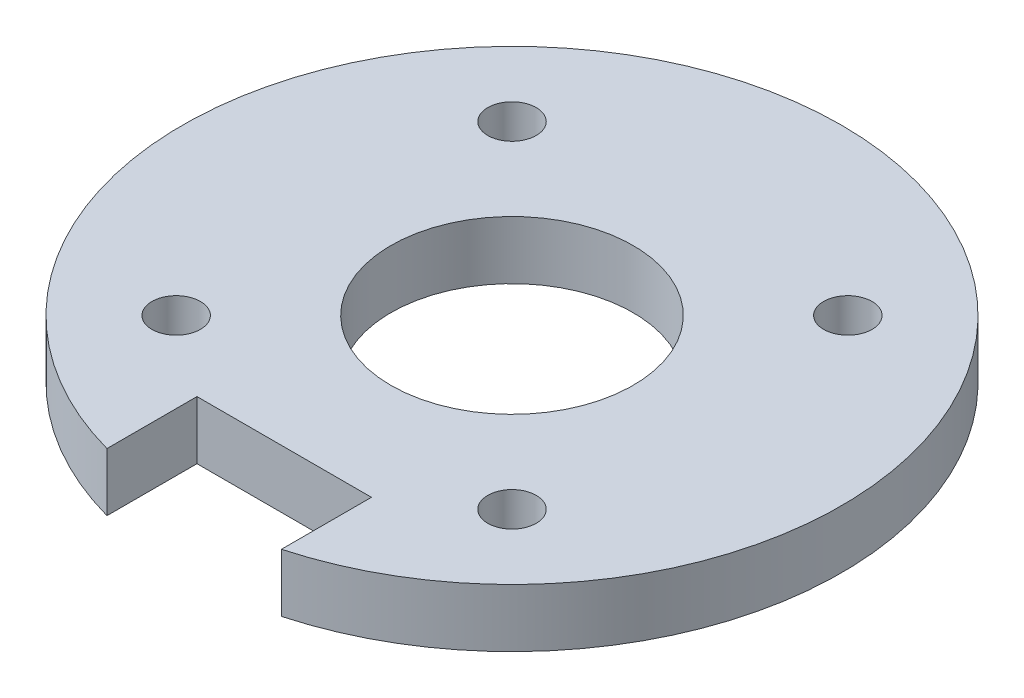
ISO-10303-21;
HEADER;
FILE_DESCRIPTION(('STEP AP214'),'2;1');
FILE_NAME('part.step','',(''),(''),'','','');
FILE_SCHEMA(('AUTOMOTIVE_DESIGN { 1 0 10303 214 1 1 1 1 }'));
ENDSEC;
DATA;
#1=APPLICATION_CONTEXT('core data for automotive mechanical design processes');
#2=APPLICATION_PROTOCOL_DEFINITION('international standard','automotive_design',2000,#1);
#3=PRODUCT_CONTEXT('',#1,'mechanical');
#4=PRODUCT('Part','Part','',(#3));
#5=PRODUCT_RELATED_PRODUCT_CATEGORY('part','',(#4));
#6=PRODUCT_DEFINITION_FORMATION('','',#4);
#7=PRODUCT_DEFINITION_CONTEXT('part definition',#1,'design');
#8=PRODUCT_DEFINITION('design','',#6,#7);
#9=PRODUCT_DEFINITION_SHAPE('','',#8);
#10=(LENGTH_UNIT() NAMED_UNIT(*) SI_UNIT(.MILLI.,.METRE.));
#11=(NAMED_UNIT(*) PLANE_ANGLE_UNIT() SI_UNIT($,.RADIAN.));
#12=(NAMED_UNIT(*) SI_UNIT($,.STERADIAN.) SOLID_ANGLE_UNIT());
#13=UNCERTAINTY_MEASURE_WITH_UNIT(LENGTH_MEASURE(1.E-05),#10,'distance_accuracy_value','');
#14=(GEOMETRIC_REPRESENTATION_CONTEXT(3) GLOBAL_UNCERTAINTY_ASSIGNED_CONTEXT((#13)) GLOBAL_UNIT_ASSIGNED_CONTEXT((#10,
#11,#12)) REPRESENTATION_CONTEXT('',''));
#15=CARTESIAN_POINT('',(0.,0.,0.));
#16=DIRECTION('',(0.,0.,1.));
#17=DIRECTION('',(1.,0.,0.));
#18=AXIS2_PLACEMENT_3D('',#15,#16,#17);
#19=CARTESIAN_POINT('',(0.,6.,0.));
#20=DIRECTION('',(0.,-1.,0.));
#21=DIRECTION('',(0.,0.,-1.));
#22=AXIS2_PLACEMENT_3D('',#19,#20,#21);
#23=CYLINDRICAL_SURFACE('',#22,34.);
#24=DIRECTION('',(0.,-1.,0.));
#25=VECTOR('',#24,1.);
#26=CARTESIAN_POINT('',(9.,6.,32.78719262151));
#27=LINE('',#26,#25);
#28=CARTESIAN_POINT('',(9.,0.,32.78719262151));
#29=VERTEX_POINT('',#28);
#30=CARTESIAN_POINT('',(9.,6.,32.78719262151));
#31=VERTEX_POINT('',#30);
#32=EDGE_CURVE('E55',#29,#31,#27,.F.);
#33=ORIENTED_EDGE('',*,*,#32,.F.);
#34=CARTESIAN_POINT('',(0.,0.,0.));
#35=DIRECTION('',(0.,1.,0.));
#36=DIRECTION('',(0.,0.,1.));
#37=AXIS2_PLACEMENT_3D('',#34,#35,#36);
#38=CIRCLE('',#37,34.);
#39=CARTESIAN_POINT('',(-9.,0.,32.78719262151));
#40=VERTEX_POINT('',#39);
#41=EDGE_CURVE('E129',#29,#40,#38,.T.);
#42=ORIENTED_EDGE('',*,*,#41,.T.);
#43=DIRECTION('',(0.,-1.,0.));
#44=VECTOR('',#43,1.);
#45=CARTESIAN_POINT('',(-9.,6.,32.78719262151));
#46=LINE('',#45,#44);
#47=CARTESIAN_POINT('',(-9.,6.,32.78719262151));
#48=VERTEX_POINT('',#47);
#49=EDGE_CURVE('E48',#48,#40,#46,.T.);
#50=ORIENTED_EDGE('',*,*,#49,.F.);
#51=CARTESIAN_POINT('',(0.,6.,0.));
#52=DIRECTION('',(0.,1.,0.));
#53=DIRECTION('',(0.,0.,1.));
#54=AXIS2_PLACEMENT_3D('',#51,#52,#53);
#55=CIRCLE('',#54,34.);
#56=EDGE_CURVE('E41',#31,#48,#55,.T.);
#57=ORIENTED_EDGE('',*,*,#56,.F.);
#58=EDGE_LOOP('',(#33,#42,#50,#57));
#59=FACE_BOUND('',#58,.T.);
#60=ADVANCED_FACE('F34',(#59),#23,.T.);
#61=CARTESIAN_POINT('',(0.,6.,0.));
#62=DIRECTION('',(0.,1.,0.));
#63=DIRECTION('',(0.,0.,1.));
#64=AXIS2_PLACEMENT_3D('',#61,#62,#63);
#65=PLANE('',#64);
#66=CARTESIAN_POINT('',(17.324,6.,-17.324));
#67=DIRECTION('',(0.,1.,0.));
#68=DIRECTION('',(0.,0.,1.));
#69=AXIS2_PLACEMENT_3D('',#66,#67,#68);
#70=CIRCLE('',#69,2.5);
#71=CARTESIAN_POINT('',(17.324,6.,-14.824));
#72=VERTEX_POINT('',#71);
#73=EDGE_CURVE('E124',#72,#72,#70,.T.);
#74=ORIENTED_EDGE('',*,*,#73,.F.);
#75=EDGE_LOOP('',(#74));
#76=FACE_BOUND('',#75,.T.);
#77=CARTESIAN_POINT('',(17.3239999999999,6.,17.3240000000001));
#78=DIRECTION('',(0.,1.,0.));
#79=DIRECTION('',(0.,0.,1.));
#80=AXIS2_PLACEMENT_3D('',#77,#78,#79);
#81=CIRCLE('',#80,2.5);
#82=CARTESIAN_POINT('',(17.3239999999999,6.,19.8240000000001));
#83=VERTEX_POINT('',#82);
#84=EDGE_CURVE('E120',#83,#83,#81,.T.);
#85=ORIENTED_EDGE('',*,*,#84,.F.);
#86=EDGE_LOOP('',(#85));
#87=FACE_BOUND('',#86,.T.);
#88=CARTESIAN_POINT('',(-17.324,6.,17.324));
#89=DIRECTION('',(0.,1.,0.));
#90=DIRECTION('',(0.,0.,1.));
#91=AXIS2_PLACEMENT_3D('',#88,#89,#90);
#92=CIRCLE('',#91,2.5);
#93=CARTESIAN_POINT('',(-17.324,6.,19.824));
#94=VERTEX_POINT('',#93);
#95=EDGE_CURVE('E114',#94,#94,#92,.T.);
#96=ORIENTED_EDGE('',*,*,#95,.F.);
#97=EDGE_LOOP('',(#96));
#98=FACE_BOUND('',#97,.T.);
#99=CARTESIAN_POINT('',(-17.3239999999998,6.,-17.3240000000002));
#100=DIRECTION('',(0.,1.,0.));
#101=DIRECTION('',(0.,0.,1.));
#102=AXIS2_PLACEMENT_3D('',#99,#100,#101);
#103=CIRCLE('',#102,2.5);
#104=CARTESIAN_POINT('',(-17.3239999999998,6.,-14.8240000000002));
#105=VERTEX_POINT('',#104);
#106=EDGE_CURVE('E106',#105,#105,#103,.T.);
#107=ORIENTED_EDGE('',*,*,#106,.F.);
#108=EDGE_LOOP('',(#107));
#109=FACE_BOUND('',#108,.T.);
#110=CARTESIAN_POINT('',(0.,6.,0.));
#111=DIRECTION('',(0.,1.,0.));
#112=DIRECTION('',(0.,0.,1.));
#113=AXIS2_PLACEMENT_3D('',#110,#111,#112);
#114=CIRCLE('',#113,12.5);
#115=CARTESIAN_POINT('',(0.,6.,12.5));
#116=VERTEX_POINT('',#115);
#117=EDGE_CURVE('E102',#116,#116,#114,.T.);
#118=ORIENTED_EDGE('',*,*,#117,.F.);
#119=EDGE_LOOP('',(#118));
#120=FACE_BOUND('',#119,.T.);
#121=DIRECTION('',(-1.,0.,0.));
#122=VECTOR('',#121,1.);
#123=CARTESIAN_POINT('',(-9.,6.,23.5));
#124=LINE('',#123,#122);
#125=CARTESIAN_POINT('',(9.,6.,23.5));
#126=VERTEX_POINT('',#125);
#127=CARTESIAN_POINT('',(-9.,6.,23.5));
#128=VERTEX_POINT('',#127);
#129=EDGE_CURVE('E81',#126,#128,#124,.T.);
#130=ORIENTED_EDGE('',*,*,#129,.F.);
#131=DIRECTION('',(0.,0.,-1.));
#132=VECTOR('',#131,1.);
#133=CARTESIAN_POINT('',(9.,6.,80.));
#134=LINE('',#133,#132);
#135=EDGE_CURVE('E72',#31,#126,#134,.T.);
#136=ORIENTED_EDGE('',*,*,#135,.F.);
#137=ORIENTED_EDGE('',*,*,#56,.T.);
#138=DIRECTION('',(0.,0.,1.));
#139=VECTOR('',#138,1.);
#140=CARTESIAN_POINT('',(-9.,6.,80.));
#141=LINE('',#140,#139);
#142=EDGE_CURVE('E93',#128,#48,#141,.T.);
#143=ORIENTED_EDGE('',*,*,#142,.F.);
#144=EDGE_LOOP('',(#130,#136,#137,#143));
#145=FACE_BOUND('',#144,.T.);
#146=ADVANCED_FACE('F92',(#76,#87,#98,#109,#120,#145),#65,.T.);
#147=CARTESIAN_POINT('',(0.,0.,0.));
#148=DIRECTION('',(0.,1.,0.));
#149=DIRECTION('',(0.,0.,1.));
#150=AXIS2_PLACEMENT_3D('',#147,#148,#149);
#151=PLANE('',#150);
#152=CARTESIAN_POINT('',(17.324,0.,-17.324));
#153=DIRECTION('',(0.,1.,0.));
#154=DIRECTION('',(0.,0.,1.));
#155=AXIS2_PLACEMENT_3D('',#152,#153,#154);
#156=CIRCLE('',#155,2.5);
#157=CARTESIAN_POINT('',(17.324,0.,-14.824));
#158=VERTEX_POINT('',#157);
#159=EDGE_CURVE('E127',#158,#158,#156,.T.);
#160=ORIENTED_EDGE('',*,*,#159,.T.);
#161=EDGE_LOOP('',(#160));
#162=FACE_BOUND('',#161,.T.);
#163=CARTESIAN_POINT('',(17.3239999999999,0.,17.3240000000001));
#164=DIRECTION('',(0.,1.,0.));
#165=DIRECTION('',(0.,0.,1.));
#166=AXIS2_PLACEMENT_3D('',#163,#164,#165);
#167=CIRCLE('',#166,2.5);
#168=CARTESIAN_POINT('',(17.3239999999999,0.,19.8240000000001));
#169=VERTEX_POINT('',#168);
#170=EDGE_CURVE('E123',#169,#169,#167,.T.);
#171=ORIENTED_EDGE('',*,*,#170,.T.);
#172=EDGE_LOOP('',(#171));
#173=FACE_BOUND('',#172,.T.);
#174=CARTESIAN_POINT('',(-17.324,0.,17.324));
#175=DIRECTION('',(0.,1.,0.));
#176=DIRECTION('',(0.,0.,1.));
#177=AXIS2_PLACEMENT_3D('',#174,#175,#176);
#178=CIRCLE('',#177,2.5);
#179=CARTESIAN_POINT('',(-17.324,0.,19.824));
#180=VERTEX_POINT('',#179);
#181=EDGE_CURVE('E117',#180,#180,#178,.T.);
#182=ORIENTED_EDGE('',*,*,#181,.T.);
#183=EDGE_LOOP('',(#182));
#184=FACE_BOUND('',#183,.T.);
#185=CARTESIAN_POINT('',(-17.3239999999998,0.,-17.3240000000002));
#186=DIRECTION('',(0.,1.,0.));
#187=DIRECTION('',(0.,0.,1.));
#188=AXIS2_PLACEMENT_3D('',#185,#186,#187);
#189=CIRCLE('',#188,2.5);
#190=CARTESIAN_POINT('',(-17.3239999999998,0.,-14.8240000000002));
#191=VERTEX_POINT('',#190);
#192=EDGE_CURVE('E111',#191,#191,#189,.T.);
#193=ORIENTED_EDGE('',*,*,#192,.T.);
#194=EDGE_LOOP('',(#193));
#195=FACE_BOUND('',#194,.T.);
#196=CARTESIAN_POINT('',(0.,0.,0.));
#197=DIRECTION('',(0.,1.,0.));
#198=DIRECTION('',(0.,0.,1.));
#199=AXIS2_PLACEMENT_3D('',#196,#197,#198);
#200=CIRCLE('',#199,12.5);
#201=CARTESIAN_POINT('',(0.,0.,12.5));
#202=VERTEX_POINT('',#201);
#203=EDGE_CURVE('E103',#202,#202,#200,.T.);
#204=ORIENTED_EDGE('',*,*,#203,.T.);
#205=EDGE_LOOP('',(#204));
#206=FACE_BOUND('',#205,.T.);
#207=DIRECTION('',(0.,0.,1.));
#208=VECTOR('',#207,1.);
#209=CARTESIAN_POINT('',(9.,0.,0.));
#210=LINE('',#209,#208);
#211=CARTESIAN_POINT('',(9.,0.,23.5));
#212=VERTEX_POINT('',#211);
#213=EDGE_CURVE('E11',#212,#29,#210,.T.);
#214=ORIENTED_EDGE('',*,*,#213,.F.);
#215=DIRECTION('',(-1.,0.,0.));
#216=VECTOR('',#215,1.);
#217=CARTESIAN_POINT('',(-9.,0.,23.5));
#218=LINE('',#217,#216);
#219=CARTESIAN_POINT('',(-9.,0.,23.5));
#220=VERTEX_POINT('',#219);
#221=EDGE_CURVE('E88',#212,#220,#218,.T.);
#222=ORIENTED_EDGE('',*,*,#221,.T.);
#223=DIRECTION('',(0.,0.,1.));
#224=VECTOR('',#223,1.);
#225=CARTESIAN_POINT('',(-9.,0.,80.));
#226=LINE('',#225,#224);
#227=EDGE_CURVE('E82',#220,#40,#226,.T.);
#228=ORIENTED_EDGE('',*,*,#227,.T.);
#229=ORIENTED_EDGE('',*,*,#41,.F.);
#230=EDGE_LOOP('',(#214,#222,#228,#229));
#231=FACE_BOUND('',#230,.T.);
#232=ADVANCED_FACE('F136',(#162,#173,#184,#195,#206,#231),#151,.F.);
#233=CARTESIAN_POINT('',(17.324,6.,-17.324));
#234=DIRECTION('',(0.,1.,0.));
#235=DIRECTION('',(0.,0.,1.));
#236=AXIS2_PLACEMENT_3D('',#233,#234,#235);
#237=CYLINDRICAL_SURFACE('',#236,2.5);
#238=ORIENTED_EDGE('',*,*,#73,.T.);
#239=EDGE_LOOP('',(#238));
#240=FACE_BOUND('',#239,.T.);
#241=ORIENTED_EDGE('',*,*,#159,.F.);
#242=EDGE_LOOP('',(#241));
#243=FACE_BOUND('',#242,.T.);
#244=ADVANCED_FACE('F142',(#240,#243),#237,.F.);
#245=CARTESIAN_POINT('',(17.3239999999999,6.,17.3240000000001));
#246=DIRECTION('',(0.,1.,0.));
#247=DIRECTION('',(0.,0.,1.));
#248=AXIS2_PLACEMENT_3D('',#245,#246,#247);
#249=CYLINDRICAL_SURFACE('',#248,2.5);
#250=ORIENTED_EDGE('',*,*,#84,.T.);
#251=EDGE_LOOP('',(#250));
#252=FACE_BOUND('',#251,.T.);
#253=ORIENTED_EDGE('',*,*,#170,.F.);
#254=EDGE_LOOP('',(#253));
#255=FACE_BOUND('',#254,.T.);
#256=ADVANCED_FACE('F139',(#252,#255),#249,.F.);
#257=CARTESIAN_POINT('',(-17.324,6.,17.324));
#258=DIRECTION('',(0.,1.,0.));
#259=DIRECTION('',(0.,0.,1.));
#260=AXIS2_PLACEMENT_3D('',#257,#258,#259);
#261=CYLINDRICAL_SURFACE('',#260,2.5);
#262=ORIENTED_EDGE('',*,*,#95,.T.);
#263=EDGE_LOOP('',(#262));
#264=FACE_BOUND('',#263,.T.);
#265=ORIENTED_EDGE('',*,*,#181,.F.);
#266=EDGE_LOOP('',(#265));
#267=FACE_BOUND('',#266,.T.);
#268=ADVANCED_FACE('F141',(#264,#267),#261,.F.);
#269=CARTESIAN_POINT('',(-17.3239999999998,6.,-17.3240000000002));
#270=DIRECTION('',(0.,1.,0.));
#271=DIRECTION('',(0.,0.,1.));
#272=AXIS2_PLACEMENT_3D('',#269,#270,#271);
#273=CYLINDRICAL_SURFACE('',#272,2.5);
#274=ORIENTED_EDGE('',*,*,#106,.T.);
#275=EDGE_LOOP('',(#274));
#276=FACE_BOUND('',#275,.T.);
#277=ORIENTED_EDGE('',*,*,#192,.F.);
#278=EDGE_LOOP('',(#277));
#279=FACE_BOUND('',#278,.T.);
#280=ADVANCED_FACE('F149',(#276,#279),#273,.F.);
#281=CARTESIAN_POINT('',(0.,0.,0.));
#282=DIRECTION('',(0.,1.,0.));
#283=DIRECTION('',(0.,0.,1.));
#284=AXIS2_PLACEMENT_3D('',#281,#282,#283);
#285=CYLINDRICAL_SURFACE('',#284,12.5);
#286=ORIENTED_EDGE('',*,*,#203,.F.);
#287=EDGE_LOOP('',(#286));
#288=FACE_BOUND('',#287,.T.);
#289=ORIENTED_EDGE('',*,*,#117,.T.);
#290=EDGE_LOOP('',(#289));
#291=FACE_BOUND('',#290,.T.);
#292=ADVANCED_FACE('F171',(#288,#291),#285,.F.);
#293=CARTESIAN_POINT('',(9.,6.,80.));
#294=DIRECTION('',(-1.,0.,0.));
#295=DIRECTION('',(0.,0.,1.));
#296=AXIS2_PLACEMENT_3D('',#293,#294,#295);
#297=PLANE('',#296);
#298=ORIENTED_EDGE('',*,*,#32,.T.);
#299=ORIENTED_EDGE('',*,*,#135,.T.);
#300=DIRECTION('',(0.,-1.,0.));
#301=VECTOR('',#300,1.);
#302=CARTESIAN_POINT('',(9.,6.,23.5));
#303=LINE('',#302,#301);
#304=EDGE_CURVE('E75',#126,#212,#303,.T.);
#305=ORIENTED_EDGE('',*,*,#304,.T.);
#306=ORIENTED_EDGE('',*,*,#213,.T.);
#307=EDGE_LOOP('',(#298,#299,#305,#306));
#308=FACE_BOUND('',#307,.T.);
#309=ADVANCED_FACE('F74',(#308),#297,.T.);
#310=CARTESIAN_POINT('',(-9.,6.,80.));
#311=DIRECTION('',(1.,0.,0.));
#312=DIRECTION('',(0.,0.,-1.));
#313=AXIS2_PLACEMENT_3D('',#310,#311,#312);
#314=PLANE('',#313);
#315=ORIENTED_EDGE('',*,*,#49,.T.);
#316=ORIENTED_EDGE('',*,*,#227,.F.);
#317=DIRECTION('',(0.,-1.,0.));
#318=VECTOR('',#317,1.);
#319=CARTESIAN_POINT('',(-9.,6.,23.5));
#320=LINE('',#319,#318);
#321=EDGE_CURVE('E89',#128,#220,#320,.T.);
#322=ORIENTED_EDGE('',*,*,#321,.F.);
#323=ORIENTED_EDGE('',*,*,#142,.T.);
#324=EDGE_LOOP('',(#315,#316,#322,#323));
#325=FACE_BOUND('',#324,.T.);
#326=ADVANCED_FACE('F163',(#325),#314,.T.);
#327=CARTESIAN_POINT('',(-9.,6.,23.5));
#328=DIRECTION('',(0.,0.,1.));
#329=DIRECTION('',(1.,0.,0.));
#330=AXIS2_PLACEMENT_3D('',#327,#328,#329);
#331=PLANE('',#330);
#332=ORIENTED_EDGE('',*,*,#221,.F.);
#333=ORIENTED_EDGE('',*,*,#304,.F.);
#334=ORIENTED_EDGE('',*,*,#129,.T.);
#335=ORIENTED_EDGE('',*,*,#321,.T.);
#336=EDGE_LOOP('',(#332,#333,#334,#335));
#337=FACE_BOUND('',#336,.T.);
#338=ADVANCED_FACE('F85',(#337),#331,.T.);
#339=CLOSED_SHELL('',(#60,#146,#232,#244,#256,#268,#280,#292,#309,#326,#338));
#340=MANIFOLD_SOLID_BREP('B2',#339);
#341=ADVANCED_BREP_SHAPE_REPRESENTATION('',(#18,#340),#14);
#342=SHAPE_DEFINITION_REPRESENTATION(#9,#341);
ENDSEC;
END-ISO-10303-21;
